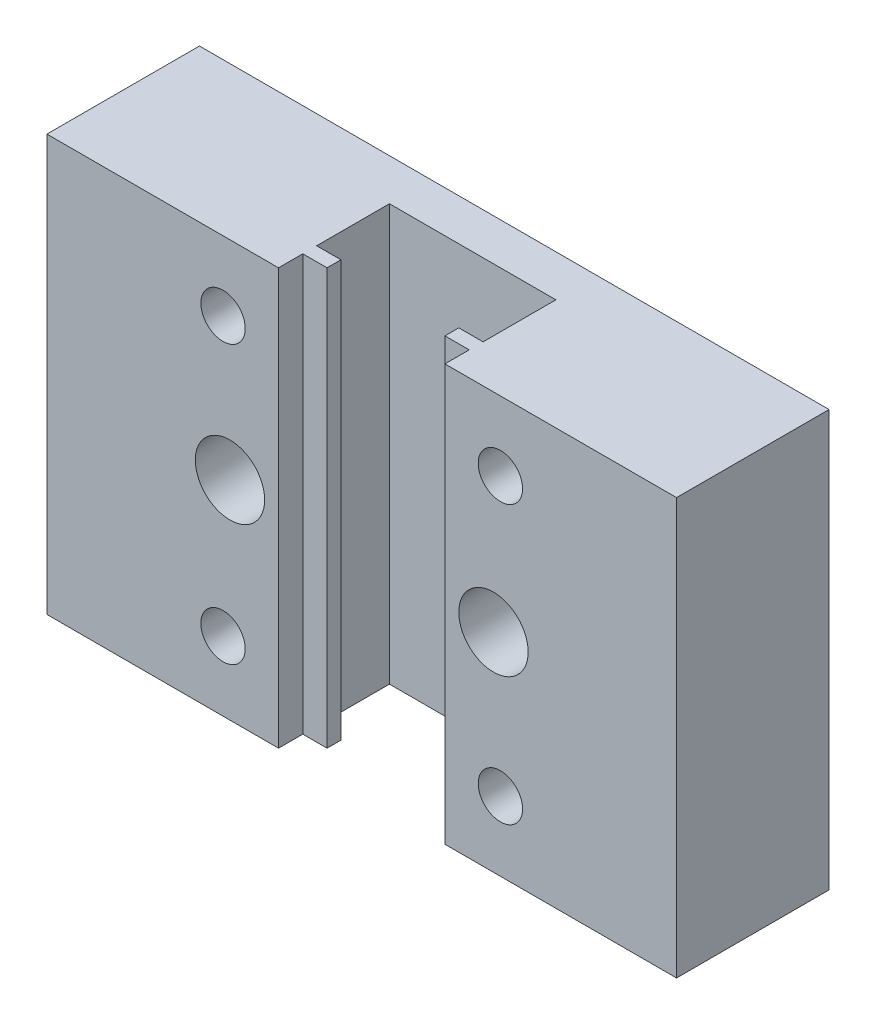
ISO-10303-21;
HEADER;
FILE_DESCRIPTION(('STEP AP214'),'2;1');
FILE_NAME('part.step','',(''),(''),'','','');
FILE_SCHEMA(('AUTOMOTIVE_DESIGN { 1 0 10303 214 1 1 1 1 }'));
ENDSEC;
DATA;
#1=APPLICATION_CONTEXT('core data for automotive mechanical design processes');
#2=APPLICATION_PROTOCOL_DEFINITION('international standard','automotive_design',2000,#1);
#3=PRODUCT_CONTEXT('',#1,'mechanical');
#4=PRODUCT('Part','Part','',(#3));
#5=PRODUCT_RELATED_PRODUCT_CATEGORY('part','',(#4));
#6=PRODUCT_DEFINITION_FORMATION('','',#4);
#7=PRODUCT_DEFINITION_CONTEXT('part definition',#1,'design');
#8=PRODUCT_DEFINITION('design','',#6,#7);
#9=PRODUCT_DEFINITION_SHAPE('','',#8);
#10=(LENGTH_UNIT() NAMED_UNIT(*) SI_UNIT(.MILLI.,.METRE.));
#11=(NAMED_UNIT(*) PLANE_ANGLE_UNIT() SI_UNIT($,.RADIAN.));
#12=(NAMED_UNIT(*) SI_UNIT($,.STERADIAN.) SOLID_ANGLE_UNIT());
#13=UNCERTAINTY_MEASURE_WITH_UNIT(LENGTH_MEASURE(1.E-05),#10,'distance_accuracy_value','');
#14=(GEOMETRIC_REPRESENTATION_CONTEXT(3) GLOBAL_UNCERTAINTY_ASSIGNED_CONTEXT((#13)) GLOBAL_UNIT_ASSIGNED_CONTEXT((#10,
#11,#12)) REPRESENTATION_CONTEXT('',''));
#15=CARTESIAN_POINT('',(0.,0.,0.));
#16=DIRECTION('',(0.,0.,1.));
#17=DIRECTION('',(1.,0.,0.));
#18=AXIS2_PLACEMENT_3D('',#15,#16,#17);
#19=CARTESIAN_POINT('',(22.7,30.,4.));
#20=DIRECTION('',(-1.,0.,0.));
#21=DIRECTION('',(0.,0.,1.));
#22=AXIS2_PLACEMENT_3D('',#19,#20,#21);
#23=PLANE('',#22);
#24=DIRECTION('',(0.,0.,-1.));
#25=VECTOR('',#24,1.);
#26=CARTESIAN_POINT('',(22.7,0.,4.));
#27=LINE('',#26,#25);
#28=CARTESIAN_POINT('',(22.7,0.,4.));
#29=VERTEX_POINT('',#28);
#30=CARTESIAN_POINT('',(22.7,0.,-7.));
#31=VERTEX_POINT('',#30);
#32=EDGE_CURVE('E189',#29,#31,#27,.T.);
#33=ORIENTED_EDGE('',*,*,#32,.T.);
#34=DIRECTION('',(0.,-1.,0.));
#35=VECTOR('',#34,1.);
#36=CARTESIAN_POINT('',(22.7,30.,-7.));
#37=LINE('',#36,#35);
#38=CARTESIAN_POINT('',(22.7,30.,-7.));
#39=VERTEX_POINT('',#38);
#40=EDGE_CURVE('E11',#39,#31,#37,.T.);
#41=ORIENTED_EDGE('',*,*,#40,.F.);
#42=DIRECTION('',(0.,0.,-1.));
#43=VECTOR('',#42,1.);
#44=CARTESIAN_POINT('',(22.7,30.,4.));
#45=LINE('',#44,#43);
#46=CARTESIAN_POINT('',(22.7,30.,4.));
#47=VERTEX_POINT('',#46);
#48=EDGE_CURVE('E220',#47,#39,#45,.T.);
#49=ORIENTED_EDGE('',*,*,#48,.F.);
#50=DIRECTION('',(0.,-1.,0.));
#51=VECTOR('',#50,1.);
#52=CARTESIAN_POINT('',(22.7,30.,4.));
#53=LINE('',#52,#51);
#54=EDGE_CURVE('E185',#47,#29,#53,.T.);
#55=ORIENTED_EDGE('',*,*,#54,.T.);
#56=EDGE_LOOP('',(#33,#41,#49,#55));
#57=FACE_BOUND('',#56,.T.);
#58=ADVANCED_FACE('F45',(#57),#23,.F.);
#59=CARTESIAN_POINT('',(-22.7,30.,-7.));
#60=DIRECTION('',(0.,0.,1.));
#61=DIRECTION('',(1.,0.,0.));
#62=AXIS2_PLACEMENT_3D('',#59,#60,#61);
#63=PLANE('',#62);
#64=CARTESIAN_POINT('',(-10.,25.,-7.));
#65=DIRECTION('',(0.,0.,1.));
#66=DIRECTION('',(1.,0.,0.));
#67=AXIS2_PLACEMENT_3D('',#64,#65,#66);
#68=CIRCLE('',#67,1.6);
#69=CARTESIAN_POINT('',(-8.4,25.,-7.));
#70=VERTEX_POINT('',#69);
#71=EDGE_CURVE('E621',#70,#70,#68,.T.);
#72=ORIENTED_EDGE('',*,*,#71,.T.);
#73=EDGE_LOOP('',(#72));
#74=FACE_BOUND('',#73,.T.);
#75=CARTESIAN_POINT('',(10.,25.,-7.));
#76=DIRECTION('',(0.,0.,1.));
#77=DIRECTION('',(1.,0.,0.));
#78=AXIS2_PLACEMENT_3D('',#75,#76,#77);
#79=CIRCLE('',#78,1.6);
#80=CARTESIAN_POINT('',(11.6,25.,-7.));
#81=VERTEX_POINT('',#80);
#82=EDGE_CURVE('E627',#81,#81,#79,.T.);
#83=ORIENTED_EDGE('',*,*,#82,.T.);
#84=EDGE_LOOP('',(#83));
#85=FACE_BOUND('',#84,.T.);
#86=CARTESIAN_POINT('',(10.0000000000002,5.,-7.));
#87=DIRECTION('',(0.,0.,1.));
#88=DIRECTION('',(1.,0.,0.));
#89=AXIS2_PLACEMENT_3D('',#86,#87,#88);
#90=CIRCLE('',#89,1.6);
#91=CARTESIAN_POINT('',(11.6000000000002,5.,-7.));
#92=VERTEX_POINT('',#91);
#93=EDGE_CURVE('E633',#92,#92,#90,.T.);
#94=ORIENTED_EDGE('',*,*,#93,.T.);
#95=EDGE_LOOP('',(#94));
#96=FACE_BOUND('',#95,.T.);
#97=CARTESIAN_POINT('',(-9.99999999999979,5.,-7.));
#98=DIRECTION('',(0.,0.,1.));
#99=DIRECTION('',(1.,0.,0.));
#100=AXIS2_PLACEMENT_3D('',#97,#98,#99);
#101=CIRCLE('',#100,1.6);
#102=CARTESIAN_POINT('',(-8.3999999999998,5.,-7.));
#103=VERTEX_POINT('',#102);
#104=EDGE_CURVE('E193',#103,#103,#101,.T.);
#105=ORIENTED_EDGE('',*,*,#104,.T.);
#106=EDGE_LOOP('',(#105));
#107=FACE_BOUND('',#106,.T.);
#108=DIRECTION('',(-1.,0.,0.));
#109=VECTOR('',#108,1.);
#110=CARTESIAN_POINT('',(-22.7,0.,-7.));
#111=LINE('',#110,#109);
#112=CARTESIAN_POINT('',(-22.7,0.,-7.));
#113=VERTEX_POINT('',#112);
#114=EDGE_CURVE('E192',#31,#113,#111,.T.);
#115=ORIENTED_EDGE('',*,*,#114,.T.);
#116=DIRECTION('',(0.,-1.,0.));
#117=VECTOR('',#116,1.);
#118=CARTESIAN_POINT('',(-22.7,30.,-7.));
#119=LINE('',#118,#117);
#120=CARTESIAN_POINT('',(-22.7,30.,-7.));
#121=VERTEX_POINT('',#120);
#122=EDGE_CURVE('E53',#121,#113,#119,.T.);
#123=ORIENTED_EDGE('',*,*,#122,.F.);
#124=DIRECTION('',(-1.,0.,0.));
#125=VECTOR('',#124,1.);
#126=CARTESIAN_POINT('',(-22.7,30.,-7.));
#127=LINE('',#126,#125);
#128=EDGE_CURVE('E128',#39,#121,#127,.T.);
#129=ORIENTED_EDGE('',*,*,#128,.F.);
#130=ORIENTED_EDGE('',*,*,#40,.T.);
#131=EDGE_LOOP('',(#115,#123,#129,#130));
#132=FACE_BOUND('',#131,.T.);
#133=ADVANCED_FACE('F321',(#74,#85,#96,#107,#132),#63,.F.);
#134=CARTESIAN_POINT('',(-22.7,30.,4.));
#135=DIRECTION('',(1.,0.,0.));
#136=DIRECTION('',(0.,0.,-1.));
#137=AXIS2_PLACEMENT_3D('',#134,#135,#136);
#138=PLANE('',#137);
#139=DIRECTION('',(0.,0.,1.));
#140=VECTOR('',#139,1.);
#141=CARTESIAN_POINT('',(-22.7,0.,4.));
#142=LINE('',#141,#140);
#143=CARTESIAN_POINT('',(-22.7,0.,4.));
#144=VERTEX_POINT('',#143);
#145=EDGE_CURVE('E195',#113,#144,#142,.T.);
#146=ORIENTED_EDGE('',*,*,#145,.T.);
#147=DIRECTION('',(0.,-1.,0.));
#148=VECTOR('',#147,1.);
#149=CARTESIAN_POINT('',(-22.7,30.,4.));
#150=LINE('',#149,#148);
#151=CARTESIAN_POINT('',(-22.7,30.,4.));
#152=VERTEX_POINT('',#151);
#153=EDGE_CURVE('E251',#152,#144,#150,.T.);
#154=ORIENTED_EDGE('',*,*,#153,.F.);
#155=DIRECTION('',(0.,0.,1.));
#156=VECTOR('',#155,1.);
#157=CARTESIAN_POINT('',(-22.7,30.,4.));
#158=LINE('',#157,#156);
#159=EDGE_CURVE('E259',#121,#152,#158,.T.);
#160=ORIENTED_EDGE('',*,*,#159,.F.);
#161=ORIENTED_EDGE('',*,*,#122,.T.);
#162=EDGE_LOOP('',(#146,#154,#160,#161));
#163=FACE_BOUND('',#162,.T.);
#164=ADVANCED_FACE('F257',(#163),#138,.F.);
#165=CARTESIAN_POINT('',(-6.,30.,4.));
#166=DIRECTION('',(0.,0.,-1.));
#167=DIRECTION('',(-1.,0.,0.));
#168=AXIS2_PLACEMENT_3D('',#165,#166,#167);
#169=PLANE('',#168);
#170=CARTESIAN_POINT('',(-9.5,15.,4.));
#171=DIRECTION('',(0.,0.,1.));
#172=DIRECTION('',(1.,0.,0.));
#173=AXIS2_PLACEMENT_3D('',#170,#171,#172);
#174=CIRCLE('',#173,2.5);
#175=CARTESIAN_POINT('',(-7.,15.,4.));
#176=VERTEX_POINT('',#175);
#177=EDGE_CURVE('E611',#176,#176,#174,.T.);
#178=ORIENTED_EDGE('',*,*,#177,.F.);
#179=EDGE_LOOP('',(#178));
#180=FACE_BOUND('',#179,.T.);
#181=CARTESIAN_POINT('',(-10.,25.,4.));
#182=DIRECTION('',(0.,0.,1.));
#183=DIRECTION('',(1.,0.,0.));
#184=AXIS2_PLACEMENT_3D('',#181,#182,#183);
#185=CIRCLE('',#184,1.6);
#186=CARTESIAN_POINT('',(-8.4,25.,4.));
#187=VERTEX_POINT('',#186);
#188=EDGE_CURVE('E618',#187,#187,#185,.T.);
#189=ORIENTED_EDGE('',*,*,#188,.F.);
#190=EDGE_LOOP('',(#189));
#191=FACE_BOUND('',#190,.T.);
#192=CARTESIAN_POINT('',(-9.99999999999979,5.,4.));
#193=DIRECTION('',(0.,0.,1.));
#194=DIRECTION('',(1.,0.,0.));
#195=AXIS2_PLACEMENT_3D('',#192,#193,#194);
#196=CIRCLE('',#195,1.6);
#197=CARTESIAN_POINT('',(-8.39999999999979,5.,4.));
#198=VERTEX_POINT('',#197);
#199=EDGE_CURVE('E636',#198,#198,#196,.T.);
#200=ORIENTED_EDGE('',*,*,#199,.F.);
#201=EDGE_LOOP('',(#200));
#202=FACE_BOUND('',#201,.T.);
#203=DIRECTION('',(1.,0.,0.));
#204=VECTOR('',#203,1.);
#205=CARTESIAN_POINT('',(-6.,0.,4.));
#206=LINE('',#205,#204);
#207=CARTESIAN_POINT('',(-6.,0.,4.));
#208=VERTEX_POINT('',#207);
#209=EDGE_CURVE('E197',#144,#208,#206,.T.);
#210=ORIENTED_EDGE('',*,*,#209,.T.);
#211=DIRECTION('',(0.,-1.,0.));
#212=VECTOR('',#211,1.);
#213=CARTESIAN_POINT('',(-6.,30.,4.));
#214=LINE('',#213,#212);
#215=CARTESIAN_POINT('',(-6.,30.,4.));
#216=VERTEX_POINT('',#215);
#217=EDGE_CURVE('E248',#216,#208,#214,.T.);
#218=ORIENTED_EDGE('',*,*,#217,.F.);
#219=DIRECTION('',(1.,0.,0.));
#220=VECTOR('',#219,1.);
#221=CARTESIAN_POINT('',(-6.,30.,4.));
#222=LINE('',#221,#220);
#223=EDGE_CURVE('E277',#152,#216,#222,.T.);
#224=ORIENTED_EDGE('',*,*,#223,.F.);
#225=ORIENTED_EDGE('',*,*,#153,.T.);
#226=EDGE_LOOP('',(#210,#218,#224,#225));
#227=FACE_BOUND('',#226,.T.);
#228=ADVANCED_FACE('F268',(#180,#191,#202,#227),#169,.F.);
#229=CARTESIAN_POINT('',(-6.,30.,4.));
#230=DIRECTION('',(-1.,0.,0.));
#231=DIRECTION('',(0.,0.,1.));
#232=AXIS2_PLACEMENT_3D('',#229,#230,#231);
#233=PLANE('',#232);
#234=DIRECTION('',(0.,0.,-1.));
#235=VECTOR('',#234,1.);
#236=CARTESIAN_POINT('',(-6.,0.,4.));
#237=LINE('',#236,#235);
#238=CARTESIAN_POINT('',(-6.,0.,2.25));
#239=VERTEX_POINT('',#238);
#240=EDGE_CURVE('E199',#208,#239,#237,.T.);
#241=ORIENTED_EDGE('',*,*,#240,.T.);
#242=DIRECTION('',(0.,-1.,0.));
#243=VECTOR('',#242,1.);
#244=CARTESIAN_POINT('',(-6.,30.,2.25));
#245=LINE('',#244,#243);
#246=CARTESIAN_POINT('',(-6.,30.,2.25));
#247=VERTEX_POINT('',#246);
#248=EDGE_CURVE('E245',#247,#239,#245,.T.);
#249=ORIENTED_EDGE('',*,*,#248,.F.);
#250=DIRECTION('',(0.,0.,-1.));
#251=VECTOR('',#250,1.);
#252=CARTESIAN_POINT('',(-6.,30.,4.));
#253=LINE('',#252,#251);
#254=EDGE_CURVE('E274',#216,#247,#253,.T.);
#255=ORIENTED_EDGE('',*,*,#254,.F.);
#256=ORIENTED_EDGE('',*,*,#217,.T.);
#257=EDGE_LOOP('',(#241,#249,#255,#256));
#258=FACE_BOUND('',#257,.T.);
#259=ADVANCED_FACE('F272',(#258),#233,.F.);
#260=CARTESIAN_POINT('',(-4.25,30.,2.25));
#261=DIRECTION('',(0.,0.,-1.));
#262=DIRECTION('',(-1.,0.,0.));
#263=AXIS2_PLACEMENT_3D('',#260,#261,#262);
#264=PLANE('',#263);
#265=DIRECTION('',(1.,0.,0.));
#266=VECTOR('',#265,1.);
#267=CARTESIAN_POINT('',(-4.25,0.,2.25));
#268=LINE('',#267,#266);
#269=CARTESIAN_POINT('',(-4.25,0.,2.25));
#270=VERTEX_POINT('',#269);
#271=EDGE_CURVE('E201',#239,#270,#268,.T.);
#272=ORIENTED_EDGE('',*,*,#271,.T.);
#273=DIRECTION('',(0.,-1.,0.));
#274=VECTOR('',#273,1.);
#275=CARTESIAN_POINT('',(-4.25,30.,2.25));
#276=LINE('',#275,#274);
#277=CARTESIAN_POINT('',(-4.25,30.,2.25));
#278=VERTEX_POINT('',#277);
#279=EDGE_CURVE('E242',#278,#270,#276,.T.);
#280=ORIENTED_EDGE('',*,*,#279,.F.);
#281=DIRECTION('',(1.,0.,0.));
#282=VECTOR('',#281,1.);
#283=CARTESIAN_POINT('',(-4.25,30.,2.25));
#284=LINE('',#283,#282);
#285=EDGE_CURVE('E276',#247,#278,#284,.T.);
#286=ORIENTED_EDGE('',*,*,#285,.F.);
#287=ORIENTED_EDGE('',*,*,#248,.T.);
#288=EDGE_LOOP('',(#272,#280,#286,#287));
#289=FACE_BOUND('',#288,.T.);
#290=ADVANCED_FACE('F338',(#289),#264,.F.);
#291=CARTESIAN_POINT('',(-4.25,30.,1.25));
#292=DIRECTION('',(-1.,0.,0.));
#293=DIRECTION('',(0.,0.,1.));
#294=AXIS2_PLACEMENT_3D('',#291,#292,#293);
#295=PLANE('',#294);
#296=DIRECTION('',(0.,0.,-1.));
#297=VECTOR('',#296,1.);
#298=CARTESIAN_POINT('',(-4.25,0.,1.25));
#299=LINE('',#298,#297);
#300=CARTESIAN_POINT('',(-4.25,0.,1.25));
#301=VERTEX_POINT('',#300);
#302=EDGE_CURVE('E203',#270,#301,#299,.T.);
#303=ORIENTED_EDGE('',*,*,#302,.T.);
#304=DIRECTION('',(0.,-1.,0.));
#305=VECTOR('',#304,1.);
#306=CARTESIAN_POINT('',(-4.25,30.,1.25));
#307=LINE('',#306,#305);
#308=CARTESIAN_POINT('',(-4.25,30.,1.25));
#309=VERTEX_POINT('',#308);
#310=EDGE_CURVE('E239',#309,#301,#307,.T.);
#311=ORIENTED_EDGE('',*,*,#310,.F.);
#312=DIRECTION('',(0.,0.,-1.));
#313=VECTOR('',#312,1.);
#314=CARTESIAN_POINT('',(-4.25,30.,1.25));
#315=LINE('',#314,#313);
#316=EDGE_CURVE('E279',#278,#309,#315,.T.);
#317=ORIENTED_EDGE('',*,*,#316,.F.);
#318=ORIENTED_EDGE('',*,*,#279,.T.);
#319=EDGE_LOOP('',(#303,#311,#317,#318));
#320=FACE_BOUND('',#319,.T.);
#321=ADVANCED_FACE('F341',(#320),#295,.F.);
#322=CARTESIAN_POINT('',(-6.,30.,1.25));
#323=DIRECTION('',(0.,0.,1.));
#324=DIRECTION('',(1.,0.,0.));
#325=AXIS2_PLACEMENT_3D('',#322,#323,#324);
#326=PLANE('',#325);
#327=DIRECTION('',(-1.,0.,0.));
#328=VECTOR('',#327,1.);
#329=CARTESIAN_POINT('',(-6.,0.,1.25));
#330=LINE('',#329,#328);
#331=CARTESIAN_POINT('',(-6.,0.,1.25));
#332=VERTEX_POINT('',#331);
#333=EDGE_CURVE('E205',#301,#332,#330,.T.);
#334=ORIENTED_EDGE('',*,*,#333,.T.);
#335=DIRECTION('',(0.,-1.,0.));
#336=VECTOR('',#335,1.);
#337=CARTESIAN_POINT('',(-6.,30.,1.25));
#338=LINE('',#337,#336);
#339=CARTESIAN_POINT('',(-6.,30.,1.25));
#340=VERTEX_POINT('',#339);
#341=EDGE_CURVE('E236',#340,#332,#338,.T.);
#342=ORIENTED_EDGE('',*,*,#341,.F.);
#343=DIRECTION('',(-1.,0.,0.));
#344=VECTOR('',#343,1.);
#345=CARTESIAN_POINT('',(-6.,30.,1.25));
#346=LINE('',#345,#344);
#347=EDGE_CURVE('E285',#309,#340,#346,.T.);
#348=ORIENTED_EDGE('',*,*,#347,.F.);
#349=ORIENTED_EDGE('',*,*,#310,.T.);
#350=EDGE_LOOP('',(#334,#342,#348,#349));
#351=FACE_BOUND('',#350,.T.);
#352=ADVANCED_FACE('F345',(#351),#326,.F.);
#353=CARTESIAN_POINT('',(-6.,30.,1.25));
#354=DIRECTION('',(-1.,0.,0.));
#355=DIRECTION('',(0.,0.,1.));
#356=AXIS2_PLACEMENT_3D('',#353,#354,#355);
#357=PLANE('',#356);
#358=DIRECTION('',(0.,0.,-1.));
#359=VECTOR('',#358,1.);
#360=CARTESIAN_POINT('',(-6.,0.,1.25));
#361=LINE('',#360,#359);
#362=CARTESIAN_POINT('',(-6.,0.,-4.));
#363=VERTEX_POINT('',#362);
#364=EDGE_CURVE('E207',#332,#363,#361,.T.);
#365=ORIENTED_EDGE('',*,*,#364,.T.);
#366=DIRECTION('',(0.,-1.,0.));
#367=VECTOR('',#366,1.);
#368=CARTESIAN_POINT('',(-6.,30.,-4.));
#369=LINE('',#368,#367);
#370=CARTESIAN_POINT('',(-6.,30.,-4.));
#371=VERTEX_POINT('',#370);
#372=EDGE_CURVE('E233',#371,#363,#369,.T.);
#373=ORIENTED_EDGE('',*,*,#372,.F.);
#374=DIRECTION('',(0.,0.,-1.));
#375=VECTOR('',#374,1.);
#376=CARTESIAN_POINT('',(-6.,30.,1.25));
#377=LINE('',#376,#375);
#378=EDGE_CURVE('E287',#340,#371,#377,.T.);
#379=ORIENTED_EDGE('',*,*,#378,.F.);
#380=ORIENTED_EDGE('',*,*,#341,.T.);
#381=EDGE_LOOP('',(#365,#373,#379,#380));
#382=FACE_BOUND('',#381,.T.);
#383=ADVANCED_FACE('F349',(#382),#357,.F.);
#384=CARTESIAN_POINT('',(-6.,30.,-4.));
#385=DIRECTION('',(0.,0.,-1.));
#386=DIRECTION('',(-1.,0.,0.));
#387=AXIS2_PLACEMENT_3D('',#384,#385,#386);
#388=PLANE('',#387);
#389=DIRECTION('',(1.,0.,0.));
#390=VECTOR('',#389,1.);
#391=CARTESIAN_POINT('',(-6.,0.,-4.));
#392=LINE('',#391,#390);
#393=CARTESIAN_POINT('',(6.,0.,-4.));
#394=VERTEX_POINT('',#393);
#395=EDGE_CURVE('E209',#363,#394,#392,.T.);
#396=ORIENTED_EDGE('',*,*,#395,.T.);
#397=DIRECTION('',(0.,-1.,0.));
#398=VECTOR('',#397,1.);
#399=CARTESIAN_POINT('',(6.,30.,-4.));
#400=LINE('',#399,#398);
#401=CARTESIAN_POINT('',(6.,30.,-4.));
#402=VERTEX_POINT('',#401);
#403=EDGE_CURVE('E230',#402,#394,#400,.T.);
#404=ORIENTED_EDGE('',*,*,#403,.F.);
#405=DIRECTION('',(1.,0.,0.));
#406=VECTOR('',#405,1.);
#407=CARTESIAN_POINT('',(-6.,30.,-4.));
#408=LINE('',#407,#406);
#409=EDGE_CURVE('E289',#371,#402,#408,.T.);
#410=ORIENTED_EDGE('',*,*,#409,.F.);
#411=ORIENTED_EDGE('',*,*,#372,.T.);
#412=EDGE_LOOP('',(#396,#404,#410,#411));
#413=FACE_BOUND('',#412,.T.);
#414=ADVANCED_FACE('F353',(#413),#388,.F.);
#415=CARTESIAN_POINT('',(6.,30.,1.25));
#416=DIRECTION('',(1.,0.,0.));
#417=DIRECTION('',(0.,0.,-1.));
#418=AXIS2_PLACEMENT_3D('',#415,#416,#417);
#419=PLANE('',#418);
#420=DIRECTION('',(0.,0.,1.));
#421=VECTOR('',#420,1.);
#422=CARTESIAN_POINT('',(6.,0.,1.25));
#423=LINE('',#422,#421);
#424=CARTESIAN_POINT('',(6.,0.,1.25));
#425=VERTEX_POINT('',#424);
#426=EDGE_CURVE('E211',#394,#425,#423,.T.);
#427=ORIENTED_EDGE('',*,*,#426,.T.);
#428=DIRECTION('',(0.,-1.,0.));
#429=VECTOR('',#428,1.);
#430=CARTESIAN_POINT('',(6.,30.,1.25));
#431=LINE('',#430,#429);
#432=CARTESIAN_POINT('',(6.,30.,1.25));
#433=VERTEX_POINT('',#432);
#434=EDGE_CURVE('E227',#433,#425,#431,.T.);
#435=ORIENTED_EDGE('',*,*,#434,.F.);
#436=DIRECTION('',(0.,0.,1.));
#437=VECTOR('',#436,1.);
#438=CARTESIAN_POINT('',(6.,30.,1.25));
#439=LINE('',#438,#437);
#440=EDGE_CURVE('E291',#402,#433,#439,.T.);
#441=ORIENTED_EDGE('',*,*,#440,.F.);
#442=ORIENTED_EDGE('',*,*,#403,.T.);
#443=EDGE_LOOP('',(#427,#435,#441,#442));
#444=FACE_BOUND('',#443,.T.);
#445=ADVANCED_FACE('F357',(#444),#419,.F.);
#446=CARTESIAN_POINT('',(6.,30.,1.25));
#447=DIRECTION('',(0.,0.,1.));
#448=DIRECTION('',(1.,0.,0.));
#449=AXIS2_PLACEMENT_3D('',#446,#447,#448);
#450=PLANE('',#449);
#451=DIRECTION('',(-1.,0.,0.));
#452=VECTOR('',#451,1.);
#453=CARTESIAN_POINT('',(6.,0.,1.25));
#454=LINE('',#453,#452);
#455=CARTESIAN_POINT('',(4.25,0.,1.25));
#456=VERTEX_POINT('',#455);
#457=EDGE_CURVE('E213',#425,#456,#454,.T.);
#458=ORIENTED_EDGE('',*,*,#457,.T.);
#459=DIRECTION('',(0.,-1.,0.));
#460=VECTOR('',#459,1.);
#461=CARTESIAN_POINT('',(4.25,30.,1.25));
#462=LINE('',#461,#460);
#463=CARTESIAN_POINT('',(4.25,30.,1.25));
#464=VERTEX_POINT('',#463);
#465=EDGE_CURVE('E224',#464,#456,#462,.T.);
#466=ORIENTED_EDGE('',*,*,#465,.F.);
#467=DIRECTION('',(-1.,0.,0.));
#468=VECTOR('',#467,1.);
#469=CARTESIAN_POINT('',(6.,30.,1.25));
#470=LINE('',#469,#468);
#471=EDGE_CURVE('E293',#433,#464,#470,.T.);
#472=ORIENTED_EDGE('',*,*,#471,.F.);
#473=ORIENTED_EDGE('',*,*,#434,.T.);
#474=EDGE_LOOP('',(#458,#466,#472,#473));
#475=FACE_BOUND('',#474,.T.);
#476=ADVANCED_FACE('F299',(#475),#450,.F.);
#477=CARTESIAN_POINT('',(4.25,30.,1.25));
#478=DIRECTION('',(1.,0.,0.));
#479=DIRECTION('',(0.,0.,-1.));
#480=AXIS2_PLACEMENT_3D('',#477,#478,#479);
#481=PLANE('',#480);
#482=DIRECTION('',(0.,0.,1.));
#483=VECTOR('',#482,1.);
#484=CARTESIAN_POINT('',(4.25,0.,1.25));
#485=LINE('',#484,#483);
#486=CARTESIAN_POINT('',(4.25,0.,2.25));
#487=VERTEX_POINT('',#486);
#488=EDGE_CURVE('E215',#456,#487,#485,.T.);
#489=ORIENTED_EDGE('',*,*,#488,.T.);
#490=DIRECTION('',(0.,-1.,0.));
#491=VECTOR('',#490,1.);
#492=CARTESIAN_POINT('',(4.25,30.,2.25));
#493=LINE('',#492,#491);
#494=CARTESIAN_POINT('',(4.25,30.,2.25));
#495=VERTEX_POINT('',#494);
#496=EDGE_CURVE('E180',#495,#487,#493,.T.);
#497=ORIENTED_EDGE('',*,*,#496,.F.);
#498=DIRECTION('',(0.,0.,1.));
#499=VECTOR('',#498,1.);
#500=CARTESIAN_POINT('',(4.25,30.,1.25));
#501=LINE('',#500,#499);
#502=EDGE_CURVE('E171',#464,#495,#501,.T.);
#503=ORIENTED_EDGE('',*,*,#502,.F.);
#504=ORIENTED_EDGE('',*,*,#465,.T.);
#505=EDGE_LOOP('',(#489,#497,#503,#504));
#506=FACE_BOUND('',#505,.T.);
#507=ADVANCED_FACE('F303',(#506),#481,.F.);
#508=CARTESIAN_POINT('',(4.25,30.,2.25));
#509=DIRECTION('',(0.,0.,-1.));
#510=DIRECTION('',(-1.,0.,0.));
#511=AXIS2_PLACEMENT_3D('',#508,#509,#510);
#512=PLANE('',#511);
#513=DIRECTION('',(1.,0.,0.));
#514=VECTOR('',#513,1.);
#515=CARTESIAN_POINT('',(4.25,0.,2.25));
#516=LINE('',#515,#514);
#517=CARTESIAN_POINT('',(6.,0.,2.25));
#518=VERTEX_POINT('',#517);
#519=EDGE_CURVE('E179',#487,#518,#516,.T.);
#520=ORIENTED_EDGE('',*,*,#519,.T.);
#521=DIRECTION('',(0.,-1.,0.));
#522=VECTOR('',#521,1.);
#523=CARTESIAN_POINT('',(6.,30.,2.25));
#524=LINE('',#523,#522);
#525=CARTESIAN_POINT('',(6.,30.,2.25));
#526=VERTEX_POINT('',#525);
#527=EDGE_CURVE('E176',#526,#518,#524,.T.);
#528=ORIENTED_EDGE('',*,*,#527,.F.);
#529=DIRECTION('',(1.,0.,0.));
#530=VECTOR('',#529,1.);
#531=CARTESIAN_POINT('',(4.25,30.,2.25));
#532=LINE('',#531,#530);
#533=EDGE_CURVE('E165',#495,#526,#532,.T.);
#534=ORIENTED_EDGE('',*,*,#533,.F.);
#535=ORIENTED_EDGE('',*,*,#496,.T.);
#536=EDGE_LOOP('',(#520,#528,#534,#535));
#537=FACE_BOUND('',#536,.T.);
#538=ADVANCED_FACE('F177',(#537),#512,.F.);
#539=CARTESIAN_POINT('',(6.,30.,4.));
#540=DIRECTION('',(1.,0.,0.));
#541=DIRECTION('',(0.,0.,-1.));
#542=AXIS2_PLACEMENT_3D('',#539,#540,#541);
#543=PLANE('',#542);
#544=DIRECTION('',(0.,0.,1.));
#545=VECTOR('',#544,1.);
#546=CARTESIAN_POINT('',(6.,0.,4.));
#547=LINE('',#546,#545);
#548=CARTESIAN_POINT('',(6.,0.,4.));
#549=VERTEX_POINT('',#548);
#550=EDGE_CURVE('E114',#518,#549,#547,.T.);
#551=ORIENTED_EDGE('',*,*,#550,.T.);
#552=DIRECTION('',(0.,-1.,0.));
#553=VECTOR('',#552,1.);
#554=CARTESIAN_POINT('',(6.,30.,4.));
#555=LINE('',#554,#553);
#556=CARTESIAN_POINT('',(6.,30.,4.));
#557=VERTEX_POINT('',#556);
#558=EDGE_CURVE('E181',#557,#549,#555,.T.);
#559=ORIENTED_EDGE('',*,*,#558,.F.);
#560=DIRECTION('',(0.,0.,1.));
#561=VECTOR('',#560,1.);
#562=CARTESIAN_POINT('',(6.,30.,4.));
#563=LINE('',#562,#561);
#564=EDGE_CURVE('E169',#526,#557,#563,.T.);
#565=ORIENTED_EDGE('',*,*,#564,.F.);
#566=ORIENTED_EDGE('',*,*,#527,.T.);
#567=EDGE_LOOP('',(#551,#559,#565,#566));
#568=FACE_BOUND('',#567,.T.);
#569=ADVANCED_FACE('F183',(#568),#543,.F.);
#570=CARTESIAN_POINT('',(6.,30.,4.));
#571=DIRECTION('',(0.,0.,-1.));
#572=DIRECTION('',(-1.,0.,0.));
#573=AXIS2_PLACEMENT_3D('',#570,#571,#572);
#574=PLANE('',#573);
#575=CARTESIAN_POINT('',(9.49999999999999,15.,4.));
#576=DIRECTION('',(0.,0.,1.));
#577=DIRECTION('',(1.,0.,0.));
#578=AXIS2_PLACEMENT_3D('',#575,#576,#577);
#579=CIRCLE('',#578,2.5);
#580=CARTESIAN_POINT('',(12.,15.,4.));
#581=VERTEX_POINT('',#580);
#582=EDGE_CURVE('E614',#581,#581,#579,.T.);
#583=ORIENTED_EDGE('',*,*,#582,.F.);
#584=EDGE_LOOP('',(#583));
#585=FACE_BOUND('',#584,.T.);
#586=CARTESIAN_POINT('',(10.,25.,4.));
#587=DIRECTION('',(0.,0.,1.));
#588=DIRECTION('',(1.,0.,0.));
#589=AXIS2_PLACEMENT_3D('',#586,#587,#588);
#590=CIRCLE('',#589,1.6);
#591=CARTESIAN_POINT('',(11.6,25.,4.));
#592=VERTEX_POINT('',#591);
#593=EDGE_CURVE('E624',#592,#592,#590,.T.);
#594=ORIENTED_EDGE('',*,*,#593,.F.);
#595=EDGE_LOOP('',(#594));
#596=FACE_BOUND('',#595,.T.);
#597=CARTESIAN_POINT('',(10.0000000000002,5.,4.));
#598=DIRECTION('',(0.,0.,1.));
#599=DIRECTION('',(1.,0.,0.));
#600=AXIS2_PLACEMENT_3D('',#597,#598,#599);
#601=CIRCLE('',#600,1.6);
#602=CARTESIAN_POINT('',(11.6000000000002,5.,4.));
#603=VERTEX_POINT('',#602);
#604=EDGE_CURVE('E630',#603,#603,#601,.T.);
#605=ORIENTED_EDGE('',*,*,#604,.F.);
#606=EDGE_LOOP('',(#605));
#607=FACE_BOUND('',#606,.T.);
#608=DIRECTION('',(1.,0.,0.));
#609=VECTOR('',#608,1.);
#610=CARTESIAN_POINT('',(6.,0.,4.));
#611=LINE('',#610,#609);
#612=EDGE_CURVE('E120',#549,#29,#611,.T.);
#613=ORIENTED_EDGE('',*,*,#612,.T.);
#614=ORIENTED_EDGE('',*,*,#54,.F.);
#615=DIRECTION('',(1.,0.,0.));
#616=VECTOR('',#615,1.);
#617=CARTESIAN_POINT('',(6.,30.,4.));
#618=LINE('',#617,#616);
#619=EDGE_CURVE('E61',#557,#47,#618,.T.);
#620=ORIENTED_EDGE('',*,*,#619,.F.);
#621=ORIENTED_EDGE('',*,*,#558,.T.);
#622=EDGE_LOOP('',(#613,#614,#620,#621));
#623=FACE_BOUND('',#622,.T.);
#624=ADVANCED_FACE('F307',(#585,#596,#607,#623),#574,.F.);
#625=CARTESIAN_POINT('',(0.,30.,0.));
#626=DIRECTION('',(0.,-1.,0.));
#627=DIRECTION('',(0.,0.,-1.));
#628=AXIS2_PLACEMENT_3D('',#625,#626,#627);
#629=PLANE('',#628);
#630=ORIENTED_EDGE('',*,*,#48,.T.);
#631=ORIENTED_EDGE('',*,*,#128,.T.);
#632=ORIENTED_EDGE('',*,*,#159,.T.);
#633=ORIENTED_EDGE('',*,*,#223,.T.);
#634=ORIENTED_EDGE('',*,*,#254,.T.);
#635=ORIENTED_EDGE('',*,*,#285,.T.);
#636=ORIENTED_EDGE('',*,*,#316,.T.);
#637=ORIENTED_EDGE('',*,*,#347,.T.);
#638=ORIENTED_EDGE('',*,*,#378,.T.);
#639=ORIENTED_EDGE('',*,*,#409,.T.);
#640=ORIENTED_EDGE('',*,*,#440,.T.);
#641=ORIENTED_EDGE('',*,*,#471,.T.);
#642=ORIENTED_EDGE('',*,*,#502,.T.);
#643=ORIENTED_EDGE('',*,*,#533,.T.);
#644=ORIENTED_EDGE('',*,*,#564,.T.);
#645=ORIENTED_EDGE('',*,*,#619,.T.);
#646=EDGE_LOOP('',(#630,#631,#632,#633,#634,#635,#636,#637,#638,#639,#640,#641,#642,#643,#644,#645));
#647=FACE_BOUND('',#646,.T.);
#648=ADVANCED_FACE('F167',(#647),#629,.F.);
#649=CARTESIAN_POINT('',(0.,0.,0.));
#650=DIRECTION('',(0.,-1.,0.));
#651=DIRECTION('',(0.,0.,-1.));
#652=AXIS2_PLACEMENT_3D('',#649,#650,#651);
#653=PLANE('',#652);
#654=ORIENTED_EDGE('',*,*,#32,.F.);
#655=ORIENTED_EDGE('',*,*,#612,.F.);
#656=ORIENTED_EDGE('',*,*,#550,.F.);
#657=ORIENTED_EDGE('',*,*,#519,.F.);
#658=ORIENTED_EDGE('',*,*,#488,.F.);
#659=ORIENTED_EDGE('',*,*,#457,.F.);
#660=ORIENTED_EDGE('',*,*,#426,.F.);
#661=ORIENTED_EDGE('',*,*,#395,.F.);
#662=ORIENTED_EDGE('',*,*,#364,.F.);
#663=ORIENTED_EDGE('',*,*,#333,.F.);
#664=ORIENTED_EDGE('',*,*,#302,.F.);
#665=ORIENTED_EDGE('',*,*,#271,.F.);
#666=ORIENTED_EDGE('',*,*,#240,.F.);
#667=ORIENTED_EDGE('',*,*,#209,.F.);
#668=ORIENTED_EDGE('',*,*,#145,.F.);
#669=ORIENTED_EDGE('',*,*,#114,.F.);
#670=EDGE_LOOP('',(#654,#655,#656,#657,#658,#659,#660,#661,#662,#663,#664,#665,#666,#667,#668,#669));
#671=FACE_BOUND('',#670,.T.);
#672=ADVANCED_FACE('F263',(#671),#653,.T.);
#673=CARTESIAN_POINT('',(-9.99999999999979,5.,4.));
#674=DIRECTION('',(0.,0.,1.));
#675=DIRECTION('',(1.,0.,0.));
#676=AXIS2_PLACEMENT_3D('',#673,#674,#675);
#677=CYLINDRICAL_SURFACE('',#676,1.6);
#678=ORIENTED_EDGE('',*,*,#104,.F.);
#679=EDGE_LOOP('',(#678));
#680=FACE_BOUND('',#679,.T.);
#681=ORIENTED_EDGE('',*,*,#199,.T.);
#682=EDGE_LOOP('',(#681));
#683=FACE_BOUND('',#682,.T.);
#684=ADVANCED_FACE('F393',(#680,#683),#677,.F.);
#685=CARTESIAN_POINT('',(10.0000000000002,5.,4.));
#686=DIRECTION('',(0.,0.,1.));
#687=DIRECTION('',(1.,0.,0.));
#688=AXIS2_PLACEMENT_3D('',#685,#686,#687);
#689=CYLINDRICAL_SURFACE('',#688,1.6);
#690=ORIENTED_EDGE('',*,*,#93,.F.);
#691=EDGE_LOOP('',(#690));
#692=FACE_BOUND('',#691,.T.);
#693=ORIENTED_EDGE('',*,*,#604,.T.);
#694=EDGE_LOOP('',(#693));
#695=FACE_BOUND('',#694,.T.);
#696=ADVANCED_FACE('F409',(#692,#695),#689,.F.);
#697=CARTESIAN_POINT('',(10.,25.,4.));
#698=DIRECTION('',(0.,0.,1.));
#699=DIRECTION('',(1.,0.,0.));
#700=AXIS2_PLACEMENT_3D('',#697,#698,#699);
#701=CYLINDRICAL_SURFACE('',#700,1.6);
#702=ORIENTED_EDGE('',*,*,#82,.F.);
#703=EDGE_LOOP('',(#702));
#704=FACE_BOUND('',#703,.T.);
#705=ORIENTED_EDGE('',*,*,#593,.T.);
#706=EDGE_LOOP('',(#705));
#707=FACE_BOUND('',#706,.T.);
#708=ADVANCED_FACE('F420',(#704,#707),#701,.F.);
#709=CARTESIAN_POINT('',(-10.,25.,4.));
#710=DIRECTION('',(0.,0.,1.));
#711=DIRECTION('',(1.,0.,0.));
#712=AXIS2_PLACEMENT_3D('',#709,#710,#711);
#713=CYLINDRICAL_SURFACE('',#712,1.6);
#714=ORIENTED_EDGE('',*,*,#71,.F.);
#715=EDGE_LOOP('',(#714));
#716=FACE_BOUND('',#715,.T.);
#717=ORIENTED_EDGE('',*,*,#188,.T.);
#718=EDGE_LOOP('',(#717));
#719=FACE_BOUND('',#718,.T.);
#720=ADVANCED_FACE('F431',(#716,#719),#713,.F.);
#721=CARTESIAN_POINT('',(9.49999999999999,15.,-4.));
#722=DIRECTION('',(0.,0.,1.));
#723=DIRECTION('',(1.,0.,0.));
#724=AXIS2_PLACEMENT_3D('',#721,#722,#723);
#725=CYLINDRICAL_SURFACE('',#724,2.5);
#726=CARTESIAN_POINT('',(9.49999999999999,15.,-4.));
#727=DIRECTION('',(0.,0.,1.));
#728=DIRECTION('',(1.,0.,0.));
#729=AXIS2_PLACEMENT_3D('',#726,#727,#728);
#730=CIRCLE('',#729,2.5);
#731=CARTESIAN_POINT('',(12.,15.,-4.));
#732=VERTEX_POINT('',#731);
#733=EDGE_CURVE('E622',#732,#732,#730,.T.);
#734=ORIENTED_EDGE('',*,*,#733,.F.);
#735=EDGE_LOOP('',(#734));
#736=FACE_BOUND('',#735,.T.);
#737=ORIENTED_EDGE('',*,*,#582,.T.);
#738=EDGE_LOOP('',(#737));
#739=FACE_BOUND('',#738,.T.);
#740=ADVANCED_FACE('F442',(#736,#739),#725,.F.);
#741=CARTESIAN_POINT('',(9.49999999999999,15.,-4.));
#742=DIRECTION('',(0.,0.,1.));
#743=DIRECTION('',(1.,0.,0.));
#744=AXIS2_PLACEMENT_3D('',#741,#742,#743);
#745=PLANE('',#744);
#746=ORIENTED_EDGE('',*,*,#733,.T.);
#747=EDGE_LOOP('',(#746));
#748=FACE_BOUND('',#747,.T.);
#749=ADVANCED_FACE('F465',(#748),#745,.T.);
#750=CARTESIAN_POINT('',(-9.5,15.,-4.));
#751=DIRECTION('',(0.,0.,1.));
#752=DIRECTION('',(1.,0.,0.));
#753=AXIS2_PLACEMENT_3D('',#750,#751,#752);
#754=CYLINDRICAL_SURFACE('',#753,2.5);
#755=CARTESIAN_POINT('',(-9.5,15.,-4.));
#756=DIRECTION('',(0.,0.,1.));
#757=DIRECTION('',(1.,0.,0.));
#758=AXIS2_PLACEMENT_3D('',#755,#756,#757);
#759=CIRCLE('',#758,2.5);
#760=CARTESIAN_POINT('',(-7.,15.,-4.));
#761=VERTEX_POINT('',#760);
#762=EDGE_CURVE('E610',#761,#761,#759,.T.);
#763=ORIENTED_EDGE('',*,*,#762,.F.);
#764=EDGE_LOOP('',(#763));
#765=FACE_BOUND('',#764,.T.);
#766=ORIENTED_EDGE('',*,*,#177,.T.);
#767=EDGE_LOOP('',(#766));
#768=FACE_BOUND('',#767,.T.);
#769=ADVANCED_FACE('F476',(#765,#768),#754,.F.);
#770=CARTESIAN_POINT('',(-9.5,15.,-4.));
#771=DIRECTION('',(0.,0.,1.));
#772=DIRECTION('',(1.,0.,0.));
#773=AXIS2_PLACEMENT_3D('',#770,#771,#772);
#774=PLANE('',#773);
#775=ORIENTED_EDGE('',*,*,#762,.T.);
#776=EDGE_LOOP('',(#775));
#777=FACE_BOUND('',#776,.T.);
#778=ADVANCED_FACE('F487',(#777),#774,.T.);
#779=CLOSED_SHELL('',(#58,#133,#164,#228,#259,#290,#321,#352,#383,#414,#445,#476,#507,#538,#569,
#624,#648,#672,#684,#696,#708,#720,#740,#749,#769,#778));
#780=MANIFOLD_SOLID_BREP('B2',#779);
#781=ADVANCED_BREP_SHAPE_REPRESENTATION('',(#18,#780),#14);
#782=SHAPE_DEFINITION_REPRESENTATION(#9,#781);
ENDSEC;
END-ISO-10303-21;
